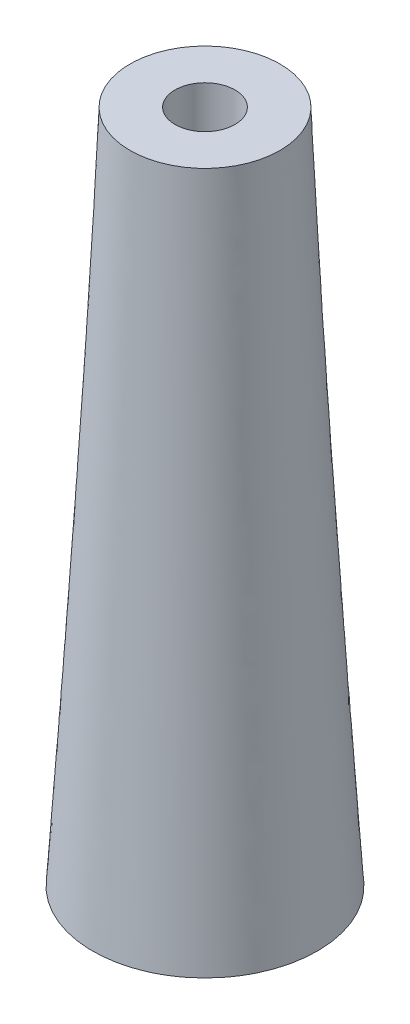
ISO-10303-21;
HEADER;
FILE_DESCRIPTION(('STEP AP214'),'2;1');
FILE_NAME('part.step','',(''),(''),'','','');
FILE_SCHEMA(('AUTOMOTIVE_DESIGN { 1 0 10303 214 1 1 1 1 }'));
ENDSEC;
DATA;
#1=APPLICATION_CONTEXT('core data for automotive mechanical design processes');
#2=APPLICATION_PROTOCOL_DEFINITION('international standard','automotive_design',2000,#1);
#3=PRODUCT_CONTEXT('',#1,'mechanical');
#4=PRODUCT('Part','Part','',(#3));
#5=PRODUCT_RELATED_PRODUCT_CATEGORY('part','',(#4));
#6=PRODUCT_DEFINITION_FORMATION('','',#4);
#7=PRODUCT_DEFINITION_CONTEXT('part definition',#1,'design');
#8=PRODUCT_DEFINITION('design','',#6,#7);
#9=PRODUCT_DEFINITION_SHAPE('','',#8);
#10=(LENGTH_UNIT() NAMED_UNIT(*) SI_UNIT(.MILLI.,.METRE.));
#11=(NAMED_UNIT(*) PLANE_ANGLE_UNIT() SI_UNIT($,.RADIAN.));
#12=(NAMED_UNIT(*) SI_UNIT($,.STERADIAN.) SOLID_ANGLE_UNIT());
#13=UNCERTAINTY_MEASURE_WITH_UNIT(LENGTH_MEASURE(1.E-05),#10,'distance_accuracy_value','');
#14=(GEOMETRIC_REPRESENTATION_CONTEXT(3) GLOBAL_UNCERTAINTY_ASSIGNED_CONTEXT((#13)) GLOBAL_UNIT_ASSIGNED_CONTEXT((#10,
#11,#12)) REPRESENTATION_CONTEXT('',''));
#15=CARTESIAN_POINT('',(0.,0.,0.));
#16=DIRECTION('',(0.,0.,1.));
#17=DIRECTION('',(1.,0.,0.));
#18=AXIS2_PLACEMENT_3D('',#15,#16,#17);
#19=CARTESIAN_POINT('',(0.,0.,0.));
#20=DIRECTION('',(0.,1.,0.));
#21=DIRECTION('',(0.,0.,1.));
#22=AXIS2_PLACEMENT_3D('',#19,#20,#21);
#23=PLANE('',#22);
#24=CARTESIAN_POINT('',(0.,0.,0.));
#25=DIRECTION('',(0.,1.,0.));
#26=DIRECTION('',(0.,0.,1.));
#27=AXIS2_PLACEMENT_3D('',#24,#25,#26);
#28=CIRCLE('',#27,20.);
#29=CARTESIAN_POINT('',(0.,0.,20.));
#30=VERTEX_POINT('',#29);
#31=EDGE_CURVE('E47',#30,#30,#28,.F.);
#32=ORIENTED_EDGE('',*,*,#31,.F.);
#33=EDGE_LOOP('',(#32));
#34=FACE_BOUND('',#33,.T.);
#35=CARTESIAN_POINT('',(0.,0.,0.));
#36=DIRECTION('',(0.,1.,0.));
#37=DIRECTION('',(0.,0.,1.));
#38=AXIS2_PLACEMENT_3D('',#35,#36,#37);
#39=CIRCLE('',#38,75.);
#40=CARTESIAN_POINT('',(52.6316454856168,0.,53.4313568373137));
#41=VERTEX_POINT('',#40);
#42=EDGE_CURVE('E11',#41,#41,#39,.T.);
#43=ORIENTED_EDGE('',*,*,#42,.F.);
#44=EDGE_LOOP('',(#43));
#45=FACE_BOUND('',#44,.T.);
#46=ADVANCED_FACE('F33',(#34,#45),#23,.F.);
#47=CARTESIAN_POINT('',(0.,450.,0.));
#48=DIRECTION('',(0.,1.,0.));
#49=DIRECTION('',(0.,0.,1.));
#50=AXIS2_PLACEMENT_3D('',#47,#48,#49);
#51=PLANE('',#50);
#52=CARTESIAN_POINT('',(0.,450.,0.));
#53=DIRECTION('',(0.,1.,0.));
#54=DIRECTION('',(0.,0.,1.));
#55=AXIS2_PLACEMENT_3D('',#52,#53,#54);
#56=CIRCLE('',#55,20.);
#57=CARTESIAN_POINT('',(0.,450.,20.));
#58=VERTEX_POINT('',#57);
#59=EDGE_CURVE('E37',#58,#58,#56,.F.);
#60=ORIENTED_EDGE('',*,*,#59,.T.);
#61=EDGE_LOOP('',(#60));
#62=FACE_BOUND('',#61,.T.);
#63=CARTESIAN_POINT('',(0.,450.,0.));
#64=DIRECTION('',(0.,1.,0.));
#65=DIRECTION('',(0.,0.,1.));
#66=AXIS2_PLACEMENT_3D('',#63,#64,#65);
#67=CIRCLE('',#66,50.);
#68=CARTESIAN_POINT('',(16.9073340298838,450.,47.0546709265078));
#69=VERTEX_POINT('',#68);
#70=EDGE_CURVE('E41',#69,#69,#67,.T.);
#71=ORIENTED_EDGE('',*,*,#70,.T.);
#72=EDGE_LOOP('',(#71));
#73=FACE_BOUND('',#72,.T.);
#74=ADVANCED_FACE('F68',(#62,#73),#51,.T.);
#75=CARTESIAN_POINT('',(16.9073340298838,450.,47.0546709265078));
#76=CARTESIAN_POINT('',(52.6316454856168,0.,53.4313568373137));
#77=CARTESIAN_POINT('',(-77.2020078231317,450.,80.8693389862753));
#78=CARTESIAN_POINT('',(-54.2310681890107,0.,158.694647808547));
#79=CARTESIAN_POINT('',(-111.016675882899,450.,-13.2400028667402));
#80=CARTESIAN_POINT('',(-159.494359160244,0.,51.8319341339198));
#81=CARTESIAN_POINT('',(-16.9073340298838,450.,-47.0546709265078));
#82=CARTESIAN_POINT('',(-52.6316454856168,0.,-53.4313568373138));
#83=CARTESIAN_POINT('',(77.2020078231317,450.,-80.8693389862753));
#84=CARTESIAN_POINT('',(54.2310681890107,0.,-158.694647808547));
#85=CARTESIAN_POINT('',(111.016675882899,450.,13.2400028667402));
#86=CARTESIAN_POINT('',(159.494359160244,0.,-51.8319341339198));
#87=CARTESIAN_POINT('',(16.9073340298838,450.,47.0546709265078));
#88=CARTESIAN_POINT('',(52.6316454856168,0.,53.4313568373137));
#89=(BOUNDED_SURFACE() B_SPLINE_SURFACE(3,1,((#75,#76),(#77,#78),(#79,#80),(#81,#82),(#83,#84),
(#85,#86),(#87,#88)),.UNSPECIFIED.,.T.,.F.,.F.) B_SPLINE_SURFACE_WITH_KNOTS((4,3,4),(2,2),(0.,
0.5,1.),(0.,1.),.UNSPECIFIED.) GEOMETRIC_REPRESENTATION_ITEM() RATIONAL_B_SPLINE_SURFACE(((1.,
1.),(0.333333333333334,0.333333333333333),(0.333333333333334,0.333333333333333),(1.,1.),
(0.333333333333333,0.333333333333333),(0.333333333333333,0.333333333333333),(1.,1.))) REPRESENTATION_ITEM('') SURFACE());
#90=CARTESIAN_POINT('',(16.9073340298838,450.,47.0546709265078));
#91=CARTESIAN_POINT('',(17.2794622742143,445.3125,47.1210947380786));
#92=CARTESIAN_POINT('',(17.6515905185449,440.625,47.1875185496495));
#93=CARTESIAN_POINT('',(18.395847007206,431.25,47.3203661727913));
#94=CARTESIAN_POINT('',(18.7679752515365,426.5625,47.3867899843622));
#95=CARTESIAN_POINT('',(19.5122317401976,417.1875,47.519637607504));
#96=CARTESIAN_POINT('',(19.8843599845282,412.5,47.5860614190749));
#97=CARTESIAN_POINT('',(20.6286164731893,403.125,47.7189090422167));
#98=CARTESIAN_POINT('',(21.0007447175198,398.4375,47.7853328537876));
#99=CARTESIAN_POINT('',(21.7450012061809,389.0625,47.9181804769294));
#100=CARTESIAN_POINT('',(22.1171294505115,384.375,47.9846042885003));
#101=CARTESIAN_POINT('',(22.8613859391726,375.,48.1174519116421));
#102=CARTESIAN_POINT('',(23.2335141835032,370.3125,48.183875723213));
#103=CARTESIAN_POINT('',(23.9777706721643,360.9375,48.3167233463548));
#104=CARTESIAN_POINT('',(24.3498989164948,356.25,48.3831471579257));
#105=CARTESIAN_POINT('',(25.0941554051559,346.875,48.5159947810675));
#106=CARTESIAN_POINT('',(25.4662836494865,342.1875,48.5824185926384));
#107=CARTESIAN_POINT('',(26.2105401381476,332.8125,48.7152662157802));
#108=CARTESIAN_POINT('',(26.5826683824781,328.125,48.781690027351));
#109=CARTESIAN_POINT('',(27.3269248711392,318.75,48.9145376504928));
#110=CARTESIAN_POINT('',(27.6990531154698,314.0625,48.9809614620637));
#111=CARTESIAN_POINT('',(28.4433096041309,304.6875,49.1138090852055));
#112=CARTESIAN_POINT('',(28.8154378484614,300.,49.1802328967764));
#113=CARTESIAN_POINT('',(29.5596943371226,290.625,49.3130805199182));
#114=CARTESIAN_POINT('',(29.9318225814531,285.9375,49.3795043314891));
#115=CARTESIAN_POINT('',(30.6760790701142,276.5625,49.5123519546309));
#116=CARTESIAN_POINT('',(31.0482073144448,271.875,49.5787757662018));
#117=CARTESIAN_POINT('',(31.7924638031059,262.5,49.7116233893436));
#118=CARTESIAN_POINT('',(32.1645920474364,257.8125,49.7780472009145));
#119=CARTESIAN_POINT('',(32.9088485360975,248.4375,49.9108948240563));
#120=CARTESIAN_POINT('',(33.2809767804281,243.75,49.9773186356272));
#121=CARTESIAN_POINT('',(34.0252332690892,234.375,50.110166258769));
#122=CARTESIAN_POINT('',(34.3973615134197,229.6875,50.1765900703399));
#123=CARTESIAN_POINT('',(35.1416180020808,220.3125,50.3094376934817));
#124=CARTESIAN_POINT('',(35.5137462464114,215.625,50.3758615050525));
#125=CARTESIAN_POINT('',(36.2580027350725,206.25,50.5087091281943));
#126=CARTESIAN_POINT('',(36.630130979403,201.5625,50.5751329397652));
#127=CARTESIAN_POINT('',(37.3743874680641,192.1875,50.707980562907));
#128=CARTESIAN_POINT('',(37.7465157123947,187.5,50.7744043744779));
#129=CARTESIAN_POINT('',(38.4907722010558,178.125,50.9072519976197));
#130=CARTESIAN_POINT('',(38.8629004453864,173.4375,50.9736758091906));
#131=CARTESIAN_POINT('',(39.6071569340475,164.0625,51.1065234323324));
#132=CARTESIAN_POINT('',(39.979285178378,159.375,51.1729472439033));
#133=CARTESIAN_POINT('',(40.7235416670391,150.,51.3057948670451));
#134=CARTESIAN_POINT('',(41.0956699113697,145.3125,51.372218678616));
#135=CARTESIAN_POINT('',(41.8399264000308,135.9375,51.5050663017578));
#136=CARTESIAN_POINT('',(42.2120546443613,131.25,51.5714901133287));
#137=CARTESIAN_POINT('',(42.9563111330224,121.875,51.7043377364705));
#138=CARTESIAN_POINT('',(43.328439377353,117.1875,51.7707615480413));
#139=CARTESIAN_POINT('',(44.0726958660141,107.8125,51.9036091711831));
#140=CARTESIAN_POINT('',(44.4448241103446,103.125,51.970032982754));
#141=CARTESIAN_POINT('',(45.1890805990057,93.75,52.1028806058958));
#142=CARTESIAN_POINT('',(45.5612088433363,89.0625,52.1693044174667));
#143=CARTESIAN_POINT('',(46.3054653319974,79.6875,52.3021520406085));
#144=CARTESIAN_POINT('',(46.677593576328,75.,52.3685758521794));
#145=CARTESIAN_POINT('',(47.4218500649891,65.625,52.5014234753212));
#146=CARTESIAN_POINT('',(47.7939783093196,60.9375,52.5678472868921));
#147=CARTESIAN_POINT('',(48.5382347979807,51.5625,52.7006949100339));
#148=CARTESIAN_POINT('',(48.9103630423113,46.875,52.7671187216048));
#149=CARTESIAN_POINT('',(49.6546195309724,37.5,52.8999663447466));
#150=CARTESIAN_POINT('',(50.0267477753029,32.8125,52.9663901563175));
#151=CARTESIAN_POINT('',(50.771004263964,23.4375,53.0992377794593));
#152=CARTESIAN_POINT('',(51.1431325082946,18.75,53.1656615910302));
#153=CARTESIAN_POINT('',(51.8873889969557,9.375,53.298509214172));
#154=CARTESIAN_POINT('',(52.2595172412862,4.68750000000001,53.3649330257429));
#155=CARTESIAN_POINT('',(52.6316454856168,0.,53.4313568373137));
#156=B_SPLINE_CURVE_WITH_KNOTS('',3,(#90,#91,#92,#93,#94,#95,#96,#97,#98,#99,#100,#101,#102,
#103,#104,#105,#106,#107,#108,#109,#110,#111,#112,#113,#114,#115,#116,#117,#118,#119,#120,#121,
#122,#123,#124,#125,#126,#127,#128,#129,#130,#131,#132,#133,#134,#135,#136,#137,#138,#139,#140,
#141,#142,#143,#144,#145,#146,#147,#148,#149,#150,#151,#152,#153,#154,#155),.UNSPECIFIED.,.F.,
.F.,(4,2,2,2,2,2,2,2,2,2,2,2,2,2,2,2,2,2,2,2,2,2,2,2,2,2,2,2,2,2,2,2,4),(0.,14.1081511980397,
28.2163023960794,42.3244535941191,56.4326047921589,70.5407559901985,84.6489071882382,
98.757058386278,112.865209584318,126.973360782357,141.081511980397,155.189663178437,
169.297814376476,183.405965574516,197.514116772556,211.622267970596,225.730419168635,
239.838570366675,253.946721564715,268.054872762754,282.163023960794,296.271175158834,
310.379326356874,324.487477554913,338.595628752953,352.703779950993,366.811931149032,
380.920082347072,395.028233545112,409.136384743151,423.244535941191,437.352687139231,
451.460838337271),.UNSPECIFIED.);
#157=EDGE_CURVE('BSEAM77',#69,#41,#156,.T.);
#158=ORIENTED_EDGE('',*,*,#70,.F.);
#159=ORIENTED_EDGE('',*,*,#42,.T.);
#160=ORIENTED_EDGE('',*,*,#157,.T.);
#161=ORIENTED_EDGE('',*,*,#157,.F.);
#162=EDGE_LOOP('',(#158,#160,#159,#161));
#163=FACE_BOUND('',#162,.T.);
#164=ADVANCED_FACE('F77',(#163),#89,.T.);
#165=CARTESIAN_POINT('',(0.,490.,0.));
#166=DIRECTION('',(0.,-1.,0.));
#167=DIRECTION('',(0.,0.,-1.));
#168=AXIS2_PLACEMENT_3D('',#165,#166,#167);
#169=CYLINDRICAL_SURFACE('',#168,20.);
#170=ORIENTED_EDGE('',*,*,#59,.F.);
#171=EDGE_LOOP('',(#170));
#172=FACE_BOUND('',#171,.T.);
#173=ORIENTED_EDGE('',*,*,#31,.T.);
#174=EDGE_LOOP('',(#173));
#175=FACE_BOUND('',#174,.T.);
#176=ADVANCED_FACE('F79',(#172,#175),#169,.F.);
#177=CLOSED_SHELL('',(#46,#74,#164,#176));
#178=MANIFOLD_SOLID_BREP('B2',#177);
#179=ADVANCED_BREP_SHAPE_REPRESENTATION('',(#18,#178),#14);
#180=SHAPE_DEFINITION_REPRESENTATION(#9,#179);
ENDSEC;
END-ISO-10303-21;
